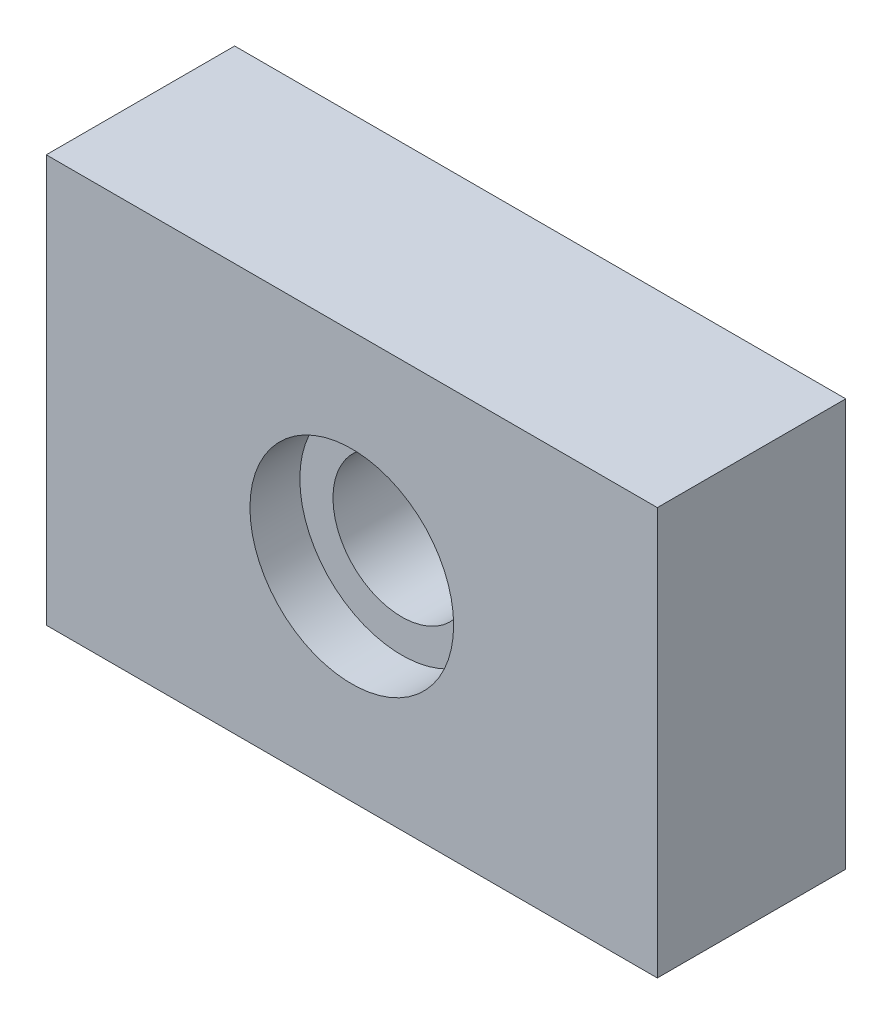
ISO-10303-21;
HEADER;
FILE_DESCRIPTION(('STEP AP214'),'2;1');
FILE_NAME('part.step','',(''),(''),'','','');
FILE_SCHEMA(('AUTOMOTIVE_DESIGN { 1 0 10303 214 1 1 1 1 }'));
ENDSEC;
DATA;
#1=APPLICATION_CONTEXT('core data for automotive mechanical design processes');
#2=APPLICATION_PROTOCOL_DEFINITION('international standard','automotive_design',2000,#1);
#3=PRODUCT_CONTEXT('',#1,'mechanical');
#4=PRODUCT('Part','Part','',(#3));
#5=PRODUCT_RELATED_PRODUCT_CATEGORY('part','',(#4));
#6=PRODUCT_DEFINITION_FORMATION('','',#4);
#7=PRODUCT_DEFINITION_CONTEXT('part definition',#1,'design');
#8=PRODUCT_DEFINITION('design','',#6,#7);
#9=PRODUCT_DEFINITION_SHAPE('','',#8);
#10=(LENGTH_UNIT() NAMED_UNIT(*) SI_UNIT(.MILLI.,.METRE.));
#11=(NAMED_UNIT(*) PLANE_ANGLE_UNIT() SI_UNIT($,.RADIAN.));
#12=(NAMED_UNIT(*) SI_UNIT($,.STERADIAN.) SOLID_ANGLE_UNIT());
#13=UNCERTAINTY_MEASURE_WITH_UNIT(LENGTH_MEASURE(1.E-05),#10,'distance_accuracy_value','');
#14=(GEOMETRIC_REPRESENTATION_CONTEXT(3) GLOBAL_UNCERTAINTY_ASSIGNED_CONTEXT((#13)) GLOBAL_UNIT_ASSIGNED_CONTEXT((#10,
#11,#12)) REPRESENTATION_CONTEXT('',''));
#15=CARTESIAN_POINT('',(0.,0.,0.));
#16=DIRECTION('',(0.,0.,1.));
#17=DIRECTION('',(1.,0.,0.));
#18=AXIS2_PLACEMENT_3D('',#15,#16,#17);
#19=CARTESIAN_POINT('',(76.2,50.8,46.99));
#20=DIRECTION('',(0.,0.,-1.));
#21=DIRECTION('',(-1.,0.,0.));
#22=AXIS2_PLACEMENT_3D('',#19,#20,#21);
#23=CYLINDRICAL_SURFACE('',#22,17.145);
#24=CARTESIAN_POINT('',(76.2,50.8,12.446));
#25=DIRECTION('',(0.,0.,-1.));
#26=DIRECTION('',(-1.,0.,0.));
#27=AXIS2_PLACEMENT_3D('',#24,#25,#26);
#28=CIRCLE('',#27,17.145);
#29=CARTESIAN_POINT('',(59.055,50.8,12.446));
#30=VERTEX_POINT('',#29);
#31=EDGE_CURVE('E122',#30,#30,#28,.T.);
#32=ORIENTED_EDGE('',*,*,#31,.T.);
#33=EDGE_LOOP('',(#32));
#34=FACE_BOUND('',#33,.T.);
#35=CARTESIAN_POINT('',(76.2,50.8,34.544));
#36=DIRECTION('',(0.,0.,-1.));
#37=DIRECTION('',(-1.,0.,0.));
#38=AXIS2_PLACEMENT_3D('',#35,#36,#37);
#39=CIRCLE('',#38,17.145);
#40=CARTESIAN_POINT('',(59.055,50.8,34.544));
#41=VERTEX_POINT('',#40);
#42=EDGE_CURVE('E115',#41,#41,#39,.T.);
#43=ORIENTED_EDGE('',*,*,#42,.F.);
#44=EDGE_LOOP('',(#43));
#45=FACE_BOUND('',#44,.T.);
#46=ADVANCED_FACE('F39',(#34,#45),#23,.F.);
#47=CARTESIAN_POINT('',(0.,0.,46.99));
#48=DIRECTION('',(0.,0.,-1.));
#49=DIRECTION('',(-1.,0.,0.));
#50=AXIS2_PLACEMENT_3D('',#47,#48,#49);
#51=PLANE('',#50);
#52=DIRECTION('',(0.,-1.,0.));
#53=VECTOR('',#52,1.);
#54=CARTESIAN_POINT('',(0.,0.,46.99));
#55=LINE('',#54,#53);
#56=CARTESIAN_POINT('',(0.,101.6,46.99));
#57=VERTEX_POINT('',#56);
#58=CARTESIAN_POINT('',(0.,0.,46.99));
#59=VERTEX_POINT('',#58);
#60=EDGE_CURVE('E134',#57,#59,#55,.T.);
#61=ORIENTED_EDGE('',*,*,#60,.T.);
#62=DIRECTION('',(1.,0.,0.));
#63=VECTOR('',#62,1.);
#64=CARTESIAN_POINT('',(0.,0.,46.99));
#65=LINE('',#64,#63);
#66=CARTESIAN_POINT('',(152.4,0.,46.99));
#67=VERTEX_POINT('',#66);
#68=EDGE_CURVE('E87',#59,#67,#65,.T.);
#69=ORIENTED_EDGE('',*,*,#68,.T.);
#70=DIRECTION('',(0.,1.,0.));
#71=VECTOR('',#70,1.);
#72=CARTESIAN_POINT('',(152.4,0.,46.99));
#73=LINE('',#72,#71);
#74=CARTESIAN_POINT('',(152.4,101.6,46.99));
#75=VERTEX_POINT('',#74);
#76=EDGE_CURVE('E137',#67,#75,#73,.T.);
#77=ORIENTED_EDGE('',*,*,#76,.T.);
#78=DIRECTION('',(-1.,0.,0.));
#79=VECTOR('',#78,1.);
#80=CARTESIAN_POINT('',(0.,101.6,46.99));
#81=LINE('',#80,#79);
#82=EDGE_CURVE('E56',#75,#57,#81,.T.);
#83=ORIENTED_EDGE('',*,*,#82,.T.);
#84=EDGE_LOOP('',(#61,#69,#77,#83));
#85=FACE_BOUND('',#84,.T.);
#86=CARTESIAN_POINT('',(76.2,50.8,46.99));
#87=DIRECTION('',(0.,0.,-1.));
#88=DIRECTION('',(-1.,0.,0.));
#89=AXIS2_PLACEMENT_3D('',#86,#87,#88);
#90=CIRCLE('',#89,25.4);
#91=CARTESIAN_POINT('',(50.8,50.8,46.99));
#92=VERTEX_POINT('',#91);
#93=EDGE_CURVE('E118',#92,#92,#90,.T.);
#94=ORIENTED_EDGE('',*,*,#93,.T.);
#95=EDGE_LOOP('',(#94));
#96=FACE_BOUND('',#95,.T.);
#97=ADVANCED_FACE('F170',(#85,#96),#51,.F.);
#98=CARTESIAN_POINT('',(0.,0.,46.99));
#99=DIRECTION('',(1.,0.,0.));
#100=DIRECTION('',(0.,1.,0.));
#101=AXIS2_PLACEMENT_3D('',#98,#99,#100);
#102=PLANE('',#101);
#103=DIRECTION('',(0.,-1.,0.));
#104=VECTOR('',#103,1.);
#105=CARTESIAN_POINT('',(0.,0.,0.));
#106=LINE('',#105,#104);
#107=CARTESIAN_POINT('',(0.,101.6,0.));
#108=VERTEX_POINT('',#107);
#109=CARTESIAN_POINT('',(0.,0.,0.));
#110=VERTEX_POINT('',#109);
#111=EDGE_CURVE('E131',#108,#110,#106,.T.);
#112=ORIENTED_EDGE('',*,*,#111,.T.);
#113=DIRECTION('',(0.,0.,-1.));
#114=VECTOR('',#113,1.);
#115=CARTESIAN_POINT('',(0.,0.,46.99));
#116=LINE('',#115,#114);
#117=EDGE_CURVE('E11',#59,#110,#116,.T.);
#118=ORIENTED_EDGE('',*,*,#117,.F.);
#119=ORIENTED_EDGE('',*,*,#60,.F.);
#120=DIRECTION('',(0.,0.,-1.));
#121=VECTOR('',#120,1.);
#122=CARTESIAN_POINT('',(0.,101.6,46.99));
#123=LINE('',#122,#121);
#124=EDGE_CURVE('E140',#57,#108,#123,.T.);
#125=ORIENTED_EDGE('',*,*,#124,.T.);
#126=EDGE_LOOP('',(#112,#118,#119,#125));
#127=FACE_BOUND('',#126,.T.);
#128=ADVANCED_FACE('F41',(#127),#102,.F.);
#129=CARTESIAN_POINT('',(0.,0.,46.99));
#130=DIRECTION('',(0.,1.,0.));
#131=DIRECTION('',(0.,0.,1.));
#132=AXIS2_PLACEMENT_3D('',#129,#130,#131);
#133=PLANE('',#132);
#134=CARTESIAN_POINT('',(66.653283,0.,23.495));
#135=DIRECTION('',(0.,-1.,0.));
#136=DIRECTION('',(0.,0.,-1.));
#137=AXIS2_PLACEMENT_3D('',#134,#135,#136);
#138=CIRCLE('',#137,5.35812999999999);
#139=CARTESIAN_POINT('',(66.653283,0.,18.13687));
#140=VERTEX_POINT('',#139);
#141=EDGE_CURVE('E105',#140,#140,#138,.T.);
#142=ORIENTED_EDGE('',*,*,#141,.F.);
#143=EDGE_LOOP('',(#142));
#144=FACE_BOUND('',#143,.T.);
#145=CARTESIAN_POINT('',(28.553283,0.,23.495));
#146=DIRECTION('',(0.,-1.,0.));
#147=DIRECTION('',(0.,0.,-1.));
#148=AXIS2_PLACEMENT_3D('',#145,#146,#147);
#149=CIRCLE('',#148,5.35812999999999);
#150=CARTESIAN_POINT('',(28.553283,0.,18.13687));
#151=VERTEX_POINT('',#150);
#152=EDGE_CURVE('E104',#151,#151,#149,.T.);
#153=ORIENTED_EDGE('',*,*,#152,.F.);
#154=EDGE_LOOP('',(#153));
#155=FACE_BOUND('',#154,.T.);
#156=DIRECTION('',(1.,0.,0.));
#157=VECTOR('',#156,1.);
#158=CARTESIAN_POINT('',(0.,0.,0.));
#159=LINE('',#158,#157);
#160=CARTESIAN_POINT('',(152.4,0.,0.));
#161=VERTEX_POINT('',#160);
#162=EDGE_CURVE('E143',#110,#161,#159,.T.);
#163=ORIENTED_EDGE('',*,*,#162,.T.);
#164=DIRECTION('',(0.,0.,-1.));
#165=VECTOR('',#164,1.);
#166=CARTESIAN_POINT('',(152.4,0.,46.99));
#167=LINE('',#166,#165);
#168=EDGE_CURVE('E48',#67,#161,#167,.T.);
#169=ORIENTED_EDGE('',*,*,#168,.F.);
#170=ORIENTED_EDGE('',*,*,#68,.F.);
#171=ORIENTED_EDGE('',*,*,#117,.T.);
#172=EDGE_LOOP('',(#163,#169,#170,#171));
#173=FACE_BOUND('',#172,.T.);
#174=ADVANCED_FACE('F167',(#144,#155,#173),#133,.F.);
#175=CARTESIAN_POINT('',(152.4,0.,46.99));
#176=DIRECTION('',(-1.,0.,0.));
#177=DIRECTION('',(0.,-1.,0.));
#178=AXIS2_PLACEMENT_3D('',#175,#176,#177);
#179=PLANE('',#178);
#180=DIRECTION('',(0.,1.,0.));
#181=VECTOR('',#180,1.);
#182=CARTESIAN_POINT('',(152.4,0.,0.));
#183=LINE('',#182,#181);
#184=CARTESIAN_POINT('',(152.4,101.6,0.));
#185=VERTEX_POINT('',#184);
#186=EDGE_CURVE('E74',#161,#185,#183,.T.);
#187=ORIENTED_EDGE('',*,*,#186,.T.);
#188=DIRECTION('',(0.,0.,-1.));
#189=VECTOR('',#188,1.);
#190=CARTESIAN_POINT('',(152.4,101.6,46.99));
#191=LINE('',#190,#189);
#192=EDGE_CURVE('E148',#75,#185,#191,.T.);
#193=ORIENTED_EDGE('',*,*,#192,.F.);
#194=ORIENTED_EDGE('',*,*,#76,.F.);
#195=ORIENTED_EDGE('',*,*,#168,.T.);
#196=EDGE_LOOP('',(#187,#193,#194,#195));
#197=FACE_BOUND('',#196,.T.);
#198=ADVANCED_FACE('F150',(#197),#179,.F.);
#199=CARTESIAN_POINT('',(0.,101.6,46.99));
#200=DIRECTION('',(0.,-1.,0.));
#201=DIRECTION('',(0.,0.,-1.));
#202=AXIS2_PLACEMENT_3D('',#199,#200,#201);
#203=PLANE('',#202);
#204=DIRECTION('',(-1.,0.,0.));
#205=VECTOR('',#204,1.);
#206=CARTESIAN_POINT('',(0.,101.6,0.));
#207=LINE('',#206,#205);
#208=EDGE_CURVE('E80',#185,#108,#207,.T.);
#209=ORIENTED_EDGE('',*,*,#208,.T.);
#210=ORIENTED_EDGE('',*,*,#124,.F.);
#211=ORIENTED_EDGE('',*,*,#82,.F.);
#212=ORIENTED_EDGE('',*,*,#192,.T.);
#213=EDGE_LOOP('',(#209,#210,#211,#212));
#214=FACE_BOUND('',#213,.T.);
#215=ADVANCED_FACE('F157',(#214),#203,.F.);
#216=CARTESIAN_POINT('',(0.,0.,0.));
#217=DIRECTION('',(0.,0.,-1.));
#218=DIRECTION('',(-1.,0.,0.));
#219=AXIS2_PLACEMENT_3D('',#216,#217,#218);
#220=PLANE('',#219);
#221=CARTESIAN_POINT('',(76.2,50.8,0.));
#222=DIRECTION('',(0.,0.,-1.));
#223=DIRECTION('',(-1.,0.,0.));
#224=AXIS2_PLACEMENT_3D('',#221,#222,#223);
#225=CIRCLE('',#224,25.4);
#226=CARTESIAN_POINT('',(50.8,50.8,0.));
#227=VERTEX_POINT('',#226);
#228=EDGE_CURVE('E127',#227,#227,#225,.T.);
#229=ORIENTED_EDGE('',*,*,#228,.F.);
#230=EDGE_LOOP('',(#229));
#231=FACE_BOUND('',#230,.T.);
#232=ORIENTED_EDGE('',*,*,#111,.F.);
#233=ORIENTED_EDGE('',*,*,#208,.F.);
#234=ORIENTED_EDGE('',*,*,#186,.F.);
#235=ORIENTED_EDGE('',*,*,#162,.F.);
#236=EDGE_LOOP('',(#232,#233,#234,#235));
#237=FACE_BOUND('',#236,.T.);
#238=ADVANCED_FACE('F153',(#231,#237),#220,.T.);
#239=CARTESIAN_POINT('',(76.2,50.8,12.446));
#240=DIRECTION('',(0.,0.,-1.));
#241=DIRECTION('',(-1.,0.,0.));
#242=AXIS2_PLACEMENT_3D('',#239,#240,#241);
#243=CYLINDRICAL_SURFACE('',#242,25.4);
#244=CARTESIAN_POINT('',(76.2,50.8,12.446));
#245=DIRECTION('',(0.,0.,-1.));
#246=DIRECTION('',(-1.,0.,0.));
#247=AXIS2_PLACEMENT_3D('',#244,#245,#246);
#248=CIRCLE('',#247,25.4);
#249=CARTESIAN_POINT('',(50.8,50.8,12.446));
#250=VERTEX_POINT('',#249);
#251=EDGE_CURVE('E128',#250,#250,#248,.T.);
#252=ORIENTED_EDGE('',*,*,#251,.F.);
#253=EDGE_LOOP('',(#252));
#254=FACE_BOUND('',#253,.T.);
#255=ORIENTED_EDGE('',*,*,#228,.T.);
#256=EDGE_LOOP('',(#255));
#257=FACE_BOUND('',#256,.T.);
#258=ADVANCED_FACE('F164',(#254,#257),#243,.F.);
#259=CARTESIAN_POINT('',(76.2,50.8,12.446));
#260=DIRECTION('',(0.,0.,-1.));
#261=DIRECTION('',(-1.,0.,0.));
#262=AXIS2_PLACEMENT_3D('',#259,#260,#261);
#263=PLANE('',#262);
#264=ORIENTED_EDGE('',*,*,#31,.F.);
#265=EDGE_LOOP('',(#264));
#266=FACE_BOUND('',#265,.T.);
#267=ORIENTED_EDGE('',*,*,#251,.T.);
#268=EDGE_LOOP('',(#267));
#269=FACE_BOUND('',#268,.T.);
#270=ADVANCED_FACE('F181',(#266,#269),#263,.T.);
#271=CARTESIAN_POINT('',(76.2,50.8,34.544));
#272=DIRECTION('',(0.,0.,1.));
#273=DIRECTION('',(-1.,0.,0.));
#274=AXIS2_PLACEMENT_3D('',#271,#272,#273);
#275=PLANE('',#274);
#276=CARTESIAN_POINT('',(76.2,50.8,34.544));
#277=DIRECTION('',(0.,0.,-1.));
#278=DIRECTION('',(-1.,0.,0.));
#279=AXIS2_PLACEMENT_3D('',#276,#277,#278);
#280=CIRCLE('',#279,25.4);
#281=CARTESIAN_POINT('',(50.8,50.8,34.544));
#282=VERTEX_POINT('',#281);
#283=EDGE_CURVE('E119',#282,#282,#280,.T.);
#284=ORIENTED_EDGE('',*,*,#283,.F.);
#285=EDGE_LOOP('',(#284));
#286=FACE_BOUND('',#285,.T.);
#287=ORIENTED_EDGE('',*,*,#42,.T.);
#288=EDGE_LOOP('',(#287));
#289=FACE_BOUND('',#288,.T.);
#290=ADVANCED_FACE('F185',(#286,#289),#275,.T.);
#291=CARTESIAN_POINT('',(76.2,50.8,34.544));
#292=DIRECTION('',(0.,0.,1.));
#293=DIRECTION('',(1.,0.,0.));
#294=AXIS2_PLACEMENT_3D('',#291,#292,#293);
#295=CYLINDRICAL_SURFACE('',#294,25.4);
#296=ORIENTED_EDGE('',*,*,#283,.T.);
#297=EDGE_LOOP('',(#296));
#298=FACE_BOUND('',#297,.T.);
#299=ORIENTED_EDGE('',*,*,#93,.F.);
#300=EDGE_LOOP('',(#299));
#301=FACE_BOUND('',#300,.T.);
#302=ADVANCED_FACE('F187',(#298,#301),#295,.F.);
#303=CARTESIAN_POINT('',(28.553283,17.78,23.495));
#304=DIRECTION('',(0.,-1.,0.));
#305=DIRECTION('',(0.,0.,-1.));
#306=AXIS2_PLACEMENT_3D('',#303,#304,#305);
#307=CONICAL_SURFACE('',#306,5.35813,1.02974425867665);
#308=CARTESIAN_POINT('',(28.553283,20.9994893086301,23.495));
#309=VERTEX_POINT('',#308);
#310=VERTEX_LOOP('',#309);
#311=FACE_BOUND('',#310,.T.);
#312=CARTESIAN_POINT('',(28.553283,17.78,23.495));
#313=DIRECTION('',(0.,-1.,0.));
#314=DIRECTION('',(0.,0.,-1.));
#315=AXIS2_PLACEMENT_3D('',#312,#313,#314);
#316=CIRCLE('',#315,5.35813);
#317=CARTESIAN_POINT('',(28.553283,17.78,18.13687));
#318=VERTEX_POINT('',#317);
#319=EDGE_CURVE('E108',#318,#318,#316,.T.);
#320=ORIENTED_EDGE('',*,*,#319,.T.);
#321=EDGE_LOOP('',(#320));
#322=FACE_BOUND('',#321,.T.);
#323=ADVANCED_FACE('F190',(#311,#322),#307,.F.);
#324=CARTESIAN_POINT('',(28.553283,0.,23.495));
#325=DIRECTION('',(0.,-1.,0.));
#326=DIRECTION('',(0.,0.,-1.));
#327=AXIS2_PLACEMENT_3D('',#324,#325,#326);
#328=CYLINDRICAL_SURFACE('',#327,5.35812999999999);
#329=ORIENTED_EDGE('',*,*,#319,.F.);
#330=EDGE_LOOP('',(#329));
#331=FACE_BOUND('',#330,.T.);
#332=ORIENTED_EDGE('',*,*,#152,.T.);
#333=EDGE_LOOP('',(#332));
#334=FACE_BOUND('',#333,.T.);
#335=ADVANCED_FACE('F98',(#331,#334),#328,.F.);
#336=CARTESIAN_POINT('',(66.653283,17.78,23.495));
#337=DIRECTION('',(0.,-1.,0.));
#338=DIRECTION('',(0.,0.,-1.));
#339=AXIS2_PLACEMENT_3D('',#336,#337,#338);
#340=CONICAL_SURFACE('',#339,5.35813,1.02974425867665);
#341=CARTESIAN_POINT('',(66.653283,20.9994893086301,23.495));
#342=VERTEX_POINT('',#341);
#343=VERTEX_LOOP('',#342);
#344=FACE_BOUND('',#343,.T.);
#345=CARTESIAN_POINT('',(66.653283,17.78,23.495));
#346=DIRECTION('',(0.,-1.,0.));
#347=DIRECTION('',(0.,0.,-1.));
#348=AXIS2_PLACEMENT_3D('',#345,#346,#347);
#349=CIRCLE('',#348,5.35813);
#350=CARTESIAN_POINT('',(66.653283,17.78,18.13687));
#351=VERTEX_POINT('',#350);
#352=EDGE_CURVE('E102',#351,#351,#349,.T.);
#353=ORIENTED_EDGE('',*,*,#352,.T.);
#354=EDGE_LOOP('',(#353));
#355=FACE_BOUND('',#354,.T.);
#356=ADVANCED_FACE('F94',(#344,#355),#340,.F.);
#357=CARTESIAN_POINT('',(66.653283,0.,23.495));
#358=DIRECTION('',(0.,-1.,0.));
#359=DIRECTION('',(0.,0.,-1.));
#360=AXIS2_PLACEMENT_3D('',#357,#358,#359);
#361=CYLINDRICAL_SURFACE('',#360,5.35813);
#362=ORIENTED_EDGE('',*,*,#352,.F.);
#363=EDGE_LOOP('',(#362));
#364=FACE_BOUND('',#363,.T.);
#365=ORIENTED_EDGE('',*,*,#141,.T.);
#366=EDGE_LOOP('',(#365));
#367=FACE_BOUND('',#366,.T.);
#368=ADVANCED_FACE('F97',(#364,#367),#361,.F.);
#369=CLOSED_SHELL('',(#46,#97,#128,#174,#198,#215,#238,#258,#270,#290,#302,#323,#335,#356,#368));
#370=MANIFOLD_SOLID_BREP('B2',#369);
#371=ADVANCED_BREP_SHAPE_REPRESENTATION('',(#18,#370),#14);
#372=SHAPE_DEFINITION_REPRESENTATION(#9,#371);
ENDSEC;
END-ISO-10303-21;
